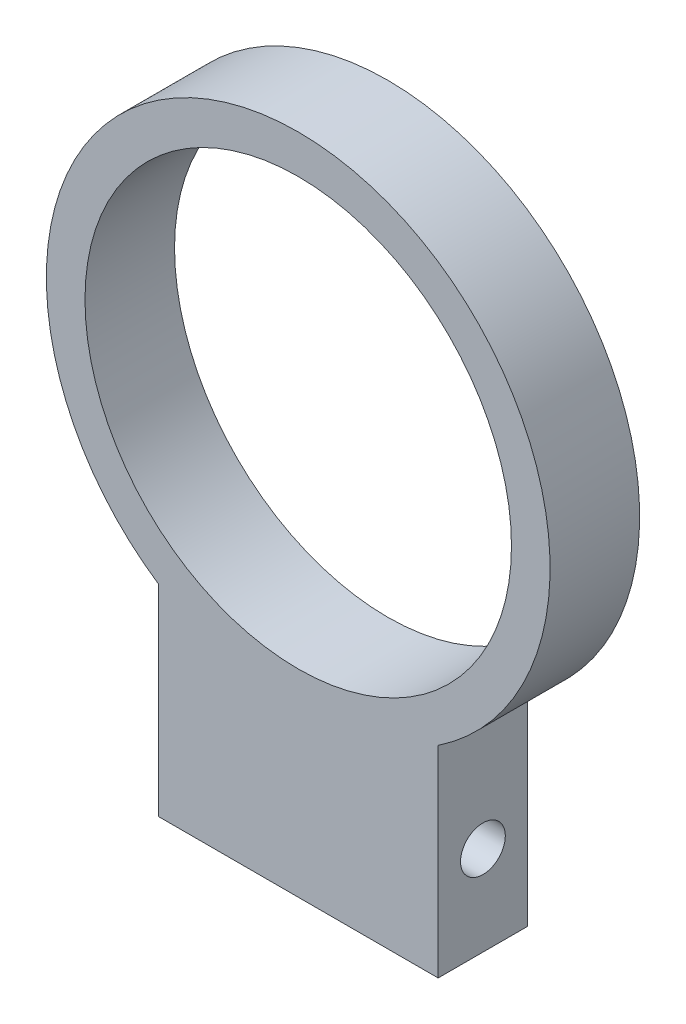
ISO-10303-21;
HEADER;
FILE_DESCRIPTION(('STEP AP214'),'2;1');
FILE_NAME('part.step','',(''),(''),'','','');
FILE_SCHEMA(('AUTOMOTIVE_DESIGN { 1 0 10303 214 1 1 1 1 }'));
ENDSEC;
DATA;
#1=APPLICATION_CONTEXT('core data for automotive mechanical design processes');
#2=APPLICATION_PROTOCOL_DEFINITION('international standard','automotive_design',2000,#1);
#3=PRODUCT_CONTEXT('',#1,'mechanical');
#4=PRODUCT('Part','Part','',(#3));
#5=PRODUCT_RELATED_PRODUCT_CATEGORY('part','',(#4));
#6=PRODUCT_DEFINITION_FORMATION('','',#4);
#7=PRODUCT_DEFINITION_CONTEXT('part definition',#1,'design');
#8=PRODUCT_DEFINITION('design','',#6,#7);
#9=PRODUCT_DEFINITION_SHAPE('','',#8);
#10=(LENGTH_UNIT() NAMED_UNIT(*) SI_UNIT(.MILLI.,.METRE.));
#11=(NAMED_UNIT(*) PLANE_ANGLE_UNIT() SI_UNIT($,.RADIAN.));
#12=(NAMED_UNIT(*) SI_UNIT($,.STERADIAN.) SOLID_ANGLE_UNIT());
#13=UNCERTAINTY_MEASURE_WITH_UNIT(LENGTH_MEASURE(1.E-05),#10,'distance_accuracy_value','');
#14=(GEOMETRIC_REPRESENTATION_CONTEXT(3) GLOBAL_UNCERTAINTY_ASSIGNED_CONTEXT((#13)) GLOBAL_UNIT_ASSIGNED_CONTEXT((#10,
#11,#12)) REPRESENTATION_CONTEXT('',''));
#15=CARTESIAN_POINT('',(0.,0.,0.));
#16=DIRECTION('',(0.,0.,1.));
#17=DIRECTION('',(1.,0.,0.));
#18=AXIS2_PLACEMENT_3D('',#15,#16,#17);
#19=CARTESIAN_POINT('',(0.,0.,8.));
#20=DIRECTION('',(0.,0.,1.));
#21=DIRECTION('',(1.,0.,0.));
#22=AXIS2_PLACEMENT_3D('',#19,#20,#21);
#23=PLANE('',#22);
#24=CARTESIAN_POINT('',(0.,0.,8.));
#25=DIRECTION('',(0.,0.,1.));
#26=DIRECTION('',(1.,0.,0.));
#27=AXIS2_PLACEMENT_3D('',#24,#25,#26);
#28=CIRCLE('',#27,22.5);
#29=CARTESIAN_POINT('',(12.5,-18.7082869338697,8.));
#30=VERTEX_POINT('',#29);
#31=CARTESIAN_POINT('',(-12.5,-18.7082869338697,8.));
#32=VERTEX_POINT('',#31);
#33=EDGE_CURVE('E85',#30,#32,#28,.T.);
#34=ORIENTED_EDGE('',*,*,#33,.T.);
#35=DIRECTION('',(0.,-1.,0.));
#36=VECTOR('',#35,1.);
#37=CARTESIAN_POINT('',(-12.5,-18.7082869338697,8.));
#38=LINE('',#37,#36);
#39=CARTESIAN_POINT('',(-12.5,-36.7082869338697,8.));
#40=VERTEX_POINT('',#39);
#41=EDGE_CURVE('E80',#32,#40,#38,.T.);
#42=ORIENTED_EDGE('',*,*,#41,.T.);
#43=DIRECTION('',(1.,0.,0.));
#44=VECTOR('',#43,1.);
#45=CARTESIAN_POINT('',(-12.5,-36.7082869338697,8.));
#46=LINE('',#45,#44);
#47=CARTESIAN_POINT('',(12.5,-36.7082869338697,8.));
#48=VERTEX_POINT('',#47);
#49=EDGE_CURVE('E83',#40,#48,#46,.T.);
#50=ORIENTED_EDGE('',*,*,#49,.T.);
#51=DIRECTION('',(0.,1.,0.));
#52=VECTOR('',#51,1.);
#53=CARTESIAN_POINT('',(12.5,-18.7082869338697,8.));
#54=LINE('',#53,#52);
#55=EDGE_CURVE('E50',#48,#30,#54,.T.);
#56=ORIENTED_EDGE('',*,*,#55,.T.);
#57=EDGE_LOOP('',(#34,#42,#50,#56));
#58=FACE_BOUND('',#57,.T.);
#59=CARTESIAN_POINT('',(0.,0.,8.));
#60=DIRECTION('',(0.,0.,1.));
#61=DIRECTION('',(1.,0.,0.));
#62=AXIS2_PLACEMENT_3D('',#59,#60,#61);
#63=CIRCLE('',#62,19.05);
#64=CARTESIAN_POINT('',(19.05,0.,8.));
#65=VERTEX_POINT('',#64);
#66=EDGE_CURVE('E100',#65,#65,#63,.T.);
#67=ORIENTED_EDGE('',*,*,#66,.F.);
#68=EDGE_LOOP('',(#67));
#69=FACE_BOUND('',#68,.T.);
#70=ADVANCED_FACE('F33',(#58,#69),#23,.T.);
#71=CARTESIAN_POINT('',(0.,0.,0.));
#72=DIRECTION('',(0.,0.,1.));
#73=DIRECTION('',(1.,0.,0.));
#74=AXIS2_PLACEMENT_3D('',#71,#72,#73);
#75=PLANE('',#74);
#76=CARTESIAN_POINT('',(0.,0.,0.));
#77=DIRECTION('',(0.,0.,1.));
#78=DIRECTION('',(1.,0.,0.));
#79=AXIS2_PLACEMENT_3D('',#76,#77,#78);
#80=CIRCLE('',#79,22.5);
#81=CARTESIAN_POINT('',(12.5,-18.7082869338697,0.));
#82=VERTEX_POINT('',#81);
#83=CARTESIAN_POINT('',(-12.5,-18.7082869338697,0.));
#84=VERTEX_POINT('',#83);
#85=EDGE_CURVE('E97',#82,#84,#80,.T.);
#86=ORIENTED_EDGE('',*,*,#85,.F.);
#87=DIRECTION('',(0.,1.,0.));
#88=VECTOR('',#87,1.);
#89=CARTESIAN_POINT('',(12.5,-18.7082869338697,0.));
#90=LINE('',#89,#88);
#91=CARTESIAN_POINT('',(12.5,-36.7082869338697,0.));
#92=VERTEX_POINT('',#91);
#93=EDGE_CURVE('E73',#92,#82,#90,.T.);
#94=ORIENTED_EDGE('',*,*,#93,.F.);
#95=DIRECTION('',(1.,0.,0.));
#96=VECTOR('',#95,1.);
#97=CARTESIAN_POINT('',(-12.5,-36.7082869338697,0.));
#98=LINE('',#97,#96);
#99=CARTESIAN_POINT('',(-12.5,-36.7082869338697,0.));
#100=VERTEX_POINT('',#99);
#101=EDGE_CURVE('E67',#100,#92,#98,.T.);
#102=ORIENTED_EDGE('',*,*,#101,.F.);
#103=DIRECTION('',(0.,-1.,0.));
#104=VECTOR('',#103,1.);
#105=CARTESIAN_POINT('',(-12.5,-18.7082869338697,0.));
#106=LINE('',#105,#104);
#107=EDGE_CURVE('E89',#84,#100,#106,.T.);
#108=ORIENTED_EDGE('',*,*,#107,.F.);
#109=EDGE_LOOP('',(#86,#94,#102,#108));
#110=FACE_BOUND('',#109,.T.);
#111=CARTESIAN_POINT('',(0.,0.,0.));
#112=DIRECTION('',(0.,0.,1.));
#113=DIRECTION('',(1.,0.,0.));
#114=AXIS2_PLACEMENT_3D('',#111,#112,#113);
#115=CIRCLE('',#114,19.05);
#116=CARTESIAN_POINT('',(19.05,0.,0.));
#117=VERTEX_POINT('',#116);
#118=EDGE_CURVE('E112',#117,#117,#115,.T.);
#119=ORIENTED_EDGE('',*,*,#118,.T.);
#120=EDGE_LOOP('',(#119));
#121=FACE_BOUND('',#120,.T.);
#122=ADVANCED_FACE('F108',(#110,#121),#75,.F.);
#123=CARTESIAN_POINT('',(0.,0.,8.));
#124=DIRECTION('',(0.,0.,-1.));
#125=DIRECTION('',(-1.,0.,0.));
#126=AXIS2_PLACEMENT_3D('',#123,#124,#125);
#127=CYLINDRICAL_SURFACE('',#126,22.5);
#128=ORIENTED_EDGE('',*,*,#85,.T.);
#129=DIRECTION('',(0.,0.,-1.));
#130=VECTOR('',#129,1.);
#131=CARTESIAN_POINT('',(-12.5,-18.7082869338697,8.));
#132=LINE('',#131,#130);
#133=EDGE_CURVE('E11',#32,#84,#132,.T.);
#134=ORIENTED_EDGE('',*,*,#133,.F.);
#135=ORIENTED_EDGE('',*,*,#33,.F.);
#136=DIRECTION('',(0.,0.,-1.));
#137=VECTOR('',#136,1.);
#138=CARTESIAN_POINT('',(12.5,-18.7082869338697,8.));
#139=LINE('',#138,#137);
#140=EDGE_CURVE('E93',#30,#82,#139,.T.);
#141=ORIENTED_EDGE('',*,*,#140,.T.);
#142=EDGE_LOOP('',(#128,#134,#135,#141));
#143=FACE_BOUND('',#142,.T.);
#144=ADVANCED_FACE('F35',(#143),#127,.T.);
#145=CARTESIAN_POINT('',(-12.5,-18.7082869338697,8.));
#146=DIRECTION('',(1.,0.,0.));
#147=DIRECTION('',(0.,1.,0.));
#148=AXIS2_PLACEMENT_3D('',#145,#146,#147);
#149=PLANE('',#148);
#150=CARTESIAN_POINT('',(-12.5,-28.7082869338697,4.));
#151=DIRECTION('',(-1.,0.,0.));
#152=DIRECTION('',(0.,-1.,0.));
#153=AXIS2_PLACEMENT_3D('',#150,#151,#152);
#154=CIRCLE('',#153,2.);
#155=CARTESIAN_POINT('',(-12.5,-30.7082869338697,4.));
#156=VERTEX_POINT('',#155);
#157=EDGE_CURVE('E120',#156,#156,#154,.T.);
#158=ORIENTED_EDGE('',*,*,#157,.F.);
#159=EDGE_LOOP('',(#158));
#160=FACE_BOUND('',#159,.T.);
#161=ORIENTED_EDGE('',*,*,#107,.T.);
#162=DIRECTION('',(0.,0.,-1.));
#163=VECTOR('',#162,1.);
#164=CARTESIAN_POINT('',(-12.5,-36.7082869338697,8.));
#165=LINE('',#164,#163);
#166=EDGE_CURVE('E42',#40,#100,#165,.T.);
#167=ORIENTED_EDGE('',*,*,#166,.F.);
#168=ORIENTED_EDGE('',*,*,#41,.F.);
#169=ORIENTED_EDGE('',*,*,#133,.T.);
#170=EDGE_LOOP('',(#161,#167,#168,#169));
#171=FACE_BOUND('',#170,.T.);
#172=ADVANCED_FACE('F88',(#160,#171),#149,.F.);
#173=CARTESIAN_POINT('',(-12.5,-36.7082869338697,8.));
#174=DIRECTION('',(0.,1.,0.));
#175=DIRECTION('',(-1.,0.,0.));
#176=AXIS2_PLACEMENT_3D('',#173,#174,#175);
#177=PLANE('',#176);
#178=ORIENTED_EDGE('',*,*,#101,.T.);
#179=DIRECTION('',(0.,0.,-1.));
#180=VECTOR('',#179,1.);
#181=CARTESIAN_POINT('',(12.5,-36.7082869338697,8.));
#182=LINE('',#181,#180);
#183=EDGE_CURVE('E90',#48,#92,#182,.T.);
#184=ORIENTED_EDGE('',*,*,#183,.F.);
#185=ORIENTED_EDGE('',*,*,#49,.F.);
#186=ORIENTED_EDGE('',*,*,#166,.T.);
#187=EDGE_LOOP('',(#178,#184,#185,#186));
#188=FACE_BOUND('',#187,.T.);
#189=ADVANCED_FACE('F91',(#188),#177,.F.);
#190=CARTESIAN_POINT('',(12.5,-18.7082869338697,8.));
#191=DIRECTION('',(-1.,0.,0.));
#192=DIRECTION('',(0.,-1.,0.));
#193=AXIS2_PLACEMENT_3D('',#190,#191,#192);
#194=PLANE('',#193);
#195=CARTESIAN_POINT('',(12.5,-28.7082869338697,4.));
#196=DIRECTION('',(-1.,0.,0.));
#197=DIRECTION('',(0.,-1.,0.));
#198=AXIS2_PLACEMENT_3D('',#195,#196,#197);
#199=CIRCLE('',#198,2.);
#200=CARTESIAN_POINT('',(12.5,-30.7082869338697,4.));
#201=VERTEX_POINT('',#200);
#202=EDGE_CURVE('E115',#201,#201,#199,.F.);
#203=ORIENTED_EDGE('',*,*,#202,.F.);
#204=EDGE_LOOP('',(#203));
#205=FACE_BOUND('',#204,.T.);
#206=ORIENTED_EDGE('',*,*,#93,.T.);
#207=ORIENTED_EDGE('',*,*,#140,.F.);
#208=ORIENTED_EDGE('',*,*,#55,.F.);
#209=ORIENTED_EDGE('',*,*,#183,.T.);
#210=EDGE_LOOP('',(#206,#207,#208,#209));
#211=FACE_BOUND('',#210,.T.);
#212=ADVANCED_FACE('F105',(#205,#211),#194,.F.);
#213=CARTESIAN_POINT('',(0.,0.,8.));
#214=DIRECTION('',(0.,0.,-1.));
#215=DIRECTION('',(-1.,0.,0.));
#216=AXIS2_PLACEMENT_3D('',#213,#214,#215);
#217=CYLINDRICAL_SURFACE('',#216,19.05);
#218=ORIENTED_EDGE('',*,*,#66,.T.);
#219=EDGE_LOOP('',(#218));
#220=FACE_BOUND('',#219,.T.);
#221=ORIENTED_EDGE('',*,*,#118,.F.);
#222=EDGE_LOOP('',(#221));
#223=FACE_BOUND('',#222,.T.);
#224=ADVANCED_FACE('F142',(#220,#223),#217,.F.);
#225=CARTESIAN_POINT('',(22.501,-28.7082869338697,4.));
#226=DIRECTION('',(-1.,0.,0.));
#227=DIRECTION('',(0.,-1.,0.));
#228=AXIS2_PLACEMENT_3D('',#225,#226,#227);
#229=CYLINDRICAL_SURFACE('',#228,2.);
#230=ORIENTED_EDGE('',*,*,#157,.T.);
#231=EDGE_LOOP('',(#230));
#232=FACE_BOUND('',#231,.T.);
#233=ORIENTED_EDGE('',*,*,#202,.T.);
#234=EDGE_LOOP('',(#233));
#235=FACE_BOUND('',#234,.T.);
#236=ADVANCED_FACE('F124',(#232,#235),#229,.F.);
#237=CLOSED_SHELL('',(#70,#122,#144,#172,#189,#212,#224,#236));
#238=MANIFOLD_SOLID_BREP('B2',#237);
#239=ADVANCED_BREP_SHAPE_REPRESENTATION('',(#18,#238),#14);
#240=SHAPE_DEFINITION_REPRESENTATION(#9,#239);
ENDSEC;
END-ISO-10303-21;
